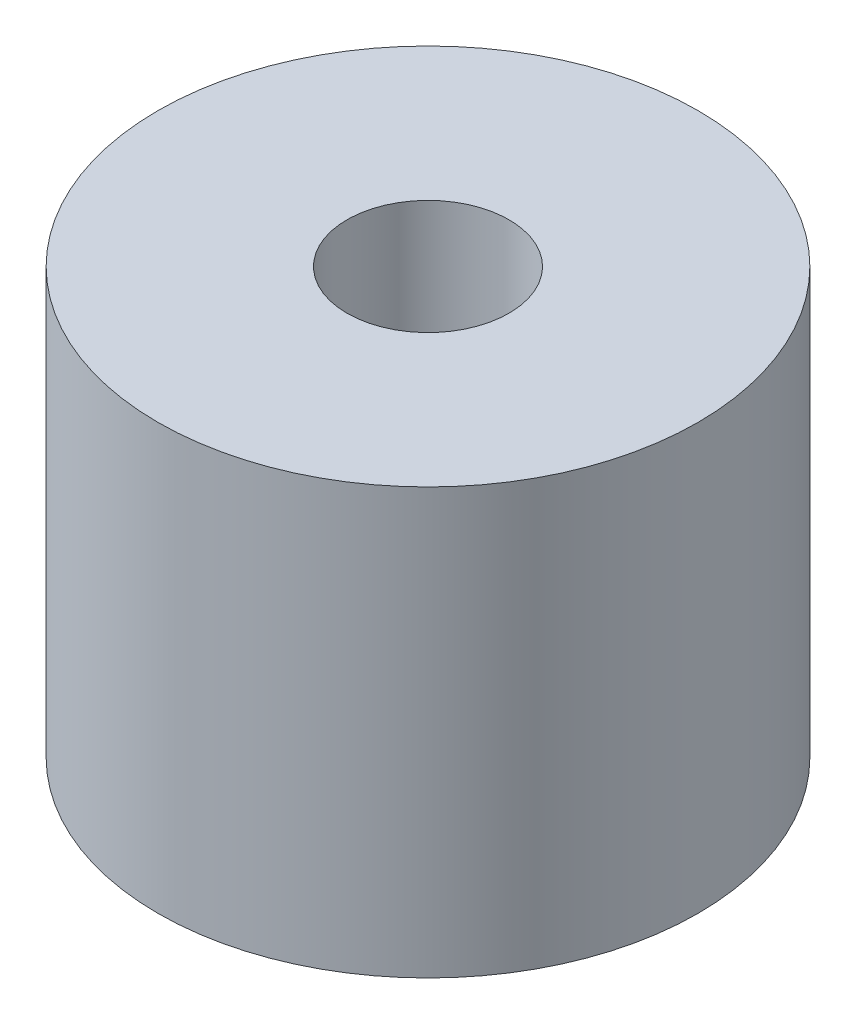
ISO-10303-21;
HEADER;
FILE_DESCRIPTION(('STEP AP214'),'2;1');
FILE_NAME('part.step','',(''),(''),'','','');
FILE_SCHEMA(('AUTOMOTIVE_DESIGN { 1 0 10303 214 1 1 1 1 }'));
ENDSEC;
DATA;
#1=APPLICATION_CONTEXT('core data for automotive mechanical design processes');
#2=APPLICATION_PROTOCOL_DEFINITION('international standard','automotive_design',2000,#1);
#3=PRODUCT_CONTEXT('',#1,'mechanical');
#4=PRODUCT('Part','Part','',(#3));
#5=PRODUCT_RELATED_PRODUCT_CATEGORY('part','',(#4));
#6=PRODUCT_DEFINITION_FORMATION('','',#4);
#7=PRODUCT_DEFINITION_CONTEXT('part definition',#1,'design');
#8=PRODUCT_DEFINITION('design','',#6,#7);
#9=PRODUCT_DEFINITION_SHAPE('','',#8);
#10=(LENGTH_UNIT() NAMED_UNIT(*) SI_UNIT(.MILLI.,.METRE.));
#11=(NAMED_UNIT(*) PLANE_ANGLE_UNIT() SI_UNIT($,.RADIAN.));
#12=(NAMED_UNIT(*) SI_UNIT($,.STERADIAN.) SOLID_ANGLE_UNIT());
#13=UNCERTAINTY_MEASURE_WITH_UNIT(LENGTH_MEASURE(1.E-05),#10,'distance_accuracy_value','');
#14=(GEOMETRIC_REPRESENTATION_CONTEXT(3) GLOBAL_UNCERTAINTY_ASSIGNED_CONTEXT((#13)) GLOBAL_UNIT_ASSIGNED_CONTEXT((#10,
#11,#12)) REPRESENTATION_CONTEXT('',''));
#15=CARTESIAN_POINT('',(0.,0.,0.));
#16=DIRECTION('',(0.,0.,1.));
#17=DIRECTION('',(1.,0.,0.));
#18=AXIS2_PLACEMENT_3D('',#15,#16,#17);
#19=CARTESIAN_POINT('',(0.,20.,0.));
#20=DIRECTION('',(0.,1.,0.));
#21=DIRECTION('',(0.,0.,1.));
#22=AXIS2_PLACEMENT_3D('',#19,#20,#21);
#23=PLANE('',#22);
#24=CARTESIAN_POINT('',(0.,20.,0.));
#25=DIRECTION('',(0.,1.,0.));
#26=DIRECTION('',(0.,0.,1.));
#27=AXIS2_PLACEMENT_3D('',#24,#25,#26);
#28=CIRCLE('',#27,12.7);
#29=CARTESIAN_POINT('',(0.,20.,12.7));
#30=VERTEX_POINT('',#29);
#31=EDGE_CURVE('E10',#30,#30,#28,.T.);
#32=ORIENTED_EDGE('',*,*,#31,.T.);
#33=EDGE_LOOP('',(#32));
#34=FACE_BOUND('',#33,.T.);
#35=CARTESIAN_POINT('',(0.,20.,0.));
#36=DIRECTION('',(0.,1.,0.));
#37=DIRECTION('',(0.,0.,1.));
#38=AXIS2_PLACEMENT_3D('',#35,#36,#37);
#39=CIRCLE('',#38,3.81);
#40=CARTESIAN_POINT('',(0.,20.,3.81));
#41=VERTEX_POINT('',#40);
#42=EDGE_CURVE('E50',#41,#41,#39,.T.);
#43=ORIENTED_EDGE('',*,*,#42,.F.);
#44=EDGE_LOOP('',(#43));
#45=FACE_BOUND('',#44,.T.);
#46=ADVANCED_FACE('F37',(#34,#45),#23,.T.);
#47=CARTESIAN_POINT('',(0.,0.,0.));
#48=DIRECTION('',(0.,1.,0.));
#49=DIRECTION('',(0.,0.,1.));
#50=AXIS2_PLACEMENT_3D('',#47,#48,#49);
#51=PLANE('',#50);
#52=CARTESIAN_POINT('',(0.,0.,0.));
#53=DIRECTION('',(0.,1.,0.));
#54=DIRECTION('',(0.,0.,1.));
#55=AXIS2_PLACEMENT_3D('',#52,#53,#54);
#56=CIRCLE('',#55,12.7);
#57=CARTESIAN_POINT('',(0.,0.,12.7));
#58=VERTEX_POINT('',#57);
#59=EDGE_CURVE('E41',#58,#58,#56,.T.);
#60=ORIENTED_EDGE('',*,*,#59,.F.);
#61=EDGE_LOOP('',(#60));
#62=FACE_BOUND('',#61,.T.);
#63=CARTESIAN_POINT('',(0.,0.,0.));
#64=DIRECTION('',(0.,1.,0.));
#65=DIRECTION('',(0.,0.,1.));
#66=AXIS2_PLACEMENT_3D('',#63,#64,#65);
#67=CIRCLE('',#66,3.81);
#68=CARTESIAN_POINT('',(0.,0.,3.81));
#69=VERTEX_POINT('',#68);
#70=EDGE_CURVE('E52',#69,#69,#67,.T.);
#71=ORIENTED_EDGE('',*,*,#70,.T.);
#72=EDGE_LOOP('',(#71));
#73=FACE_BOUND('',#72,.T.);
#74=ADVANCED_FACE('F64',(#62,#73),#51,.F.);
#75=CARTESIAN_POINT('',(0.,20.,0.));
#76=DIRECTION('',(0.,-1.,0.));
#77=DIRECTION('',(0.,0.,-1.));
#78=AXIS2_PLACEMENT_3D('',#75,#76,#77);
#79=CYLINDRICAL_SURFACE('',#78,12.7);
#80=ORIENTED_EDGE('',*,*,#31,.F.);
#81=EDGE_LOOP('',(#80));
#82=FACE_BOUND('',#81,.T.);
#83=ORIENTED_EDGE('',*,*,#59,.T.);
#84=EDGE_LOOP('',(#83));
#85=FACE_BOUND('',#84,.T.);
#86=ADVANCED_FACE('F39',(#82,#85),#79,.T.);
#87=CARTESIAN_POINT('',(0.,20.,0.));
#88=DIRECTION('',(0.,-1.,0.));
#89=DIRECTION('',(0.,0.,-1.));
#90=AXIS2_PLACEMENT_3D('',#87,#88,#89);
#91=CYLINDRICAL_SURFACE('',#90,3.81);
#92=ORIENTED_EDGE('',*,*,#42,.T.);
#93=EDGE_LOOP('',(#92));
#94=FACE_BOUND('',#93,.T.);
#95=ORIENTED_EDGE('',*,*,#70,.F.);
#96=EDGE_LOOP('',(#95));
#97=FACE_BOUND('',#96,.T.);
#98=ADVANCED_FACE('F60',(#94,#97),#91,.F.);
#99=CLOSED_SHELL('',(#46,#74,#86,#98));
#100=MANIFOLD_SOLID_BREP('B2',#99);
#101=ADVANCED_BREP_SHAPE_REPRESENTATION('',(#18,#100),#14);
#102=SHAPE_DEFINITION_REPRESENTATION(#9,#101);
ENDSEC;
END-ISO-10303-21;
